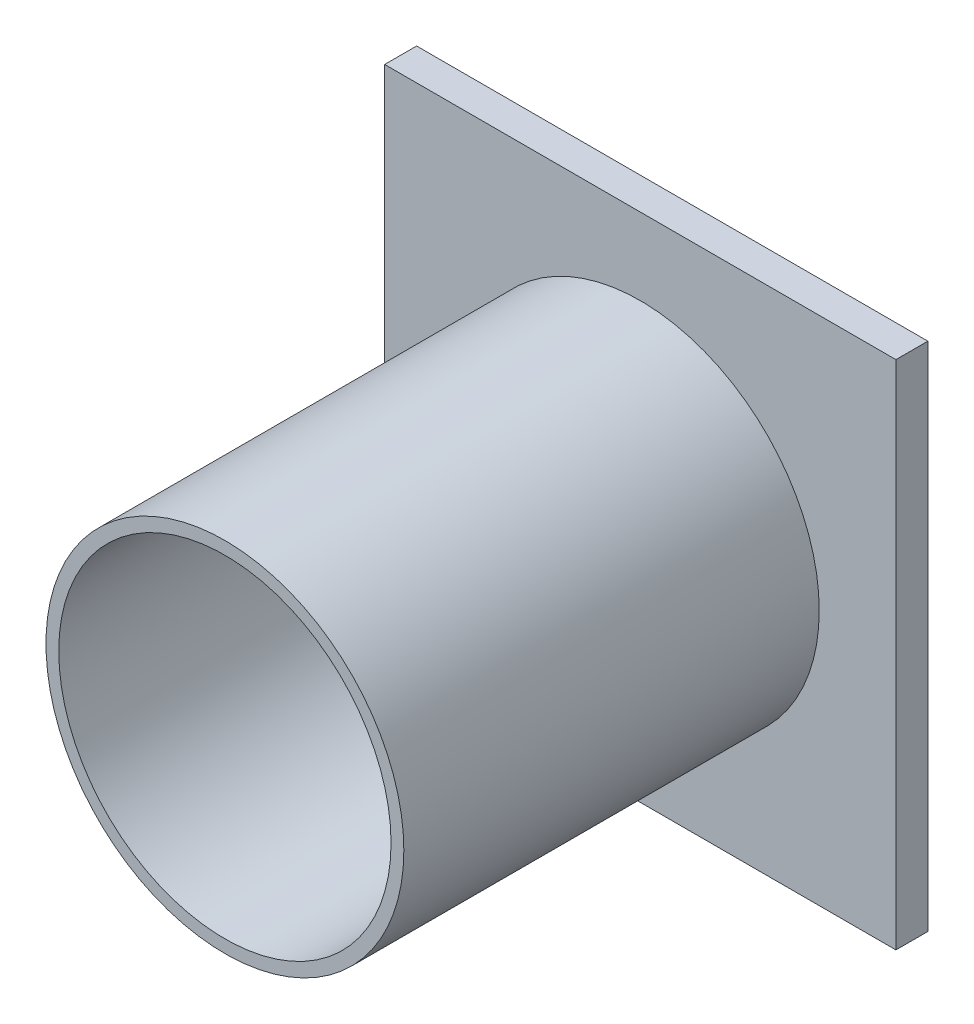
ISO-10303-21;
HEADER;
FILE_DESCRIPTION(('STEP AP214'),'2;1');
FILE_NAME('part.step','',(''),(''),'','','');
FILE_SCHEMA(('AUTOMOTIVE_DESIGN { 1 0 10303 214 1 1 1 1 }'));
ENDSEC;
DATA;
#1=APPLICATION_CONTEXT('core data for automotive mechanical design processes');
#2=APPLICATION_PROTOCOL_DEFINITION('international standard','automotive_design',2000,#1);
#3=PRODUCT_CONTEXT('',#1,'mechanical');
#4=PRODUCT('Part','Part','',(#3));
#5=PRODUCT_RELATED_PRODUCT_CATEGORY('part','',(#4));
#6=PRODUCT_DEFINITION_FORMATION('','',#4);
#7=PRODUCT_DEFINITION_CONTEXT('part definition',#1,'design');
#8=PRODUCT_DEFINITION('design','',#6,#7);
#9=PRODUCT_DEFINITION_SHAPE('','',#8);
#10=(LENGTH_UNIT() NAMED_UNIT(*) SI_UNIT(.MILLI.,.METRE.));
#11=(NAMED_UNIT(*) PLANE_ANGLE_UNIT() SI_UNIT($,.RADIAN.));
#12=(NAMED_UNIT(*) SI_UNIT($,.STERADIAN.) SOLID_ANGLE_UNIT());
#13=UNCERTAINTY_MEASURE_WITH_UNIT(LENGTH_MEASURE(1.E-05),#10,'distance_accuracy_value','');
#14=(GEOMETRIC_REPRESENTATION_CONTEXT(3) GLOBAL_UNCERTAINTY_ASSIGNED_CONTEXT((#13)) GLOBAL_UNIT_ASSIGNED_CONTEXT((#10,
#11,#12)) REPRESENTATION_CONTEXT('',''));
#15=CARTESIAN_POINT('',(0.,0.,0.));
#16=DIRECTION('',(0.,0.,1.));
#17=DIRECTION('',(1.,0.,0.));
#18=AXIS2_PLACEMENT_3D('',#15,#16,#17);
#19=CARTESIAN_POINT('',(-29.9186991869918,28.9430894308943,5.));
#20=DIRECTION('',(1.,0.,0.));
#21=DIRECTION('',(0.,1.,0.));
#22=AXIS2_PLACEMENT_3D('',#19,#20,#21);
#23=PLANE('',#22);
#24=DIRECTION('',(0.,-1.,0.));
#25=VECTOR('',#24,1.);
#26=CARTESIAN_POINT('',(-29.9186991869918,28.9430894308943,0.));
#27=LINE('',#26,#25);
#28=CARTESIAN_POINT('',(-29.9186991869918,28.9430894308943,0.));
#29=VERTEX_POINT('',#28);
#30=CARTESIAN_POINT('',(-29.9186991869918,-51.0569105691057,0.));
#31=VERTEX_POINT('',#30);
#32=EDGE_CURVE('E104',#29,#31,#27,.T.);
#33=ORIENTED_EDGE('',*,*,#32,.T.);
#34=DIRECTION('',(0.,0.,-1.));
#35=VECTOR('',#34,1.);
#36=CARTESIAN_POINT('',(-29.9186991869918,-51.0569105691057,5.));
#37=LINE('',#36,#35);
#38=CARTESIAN_POINT('',(-29.9186991869918,-51.0569105691057,5.));
#39=VERTEX_POINT('',#38);
#40=EDGE_CURVE('E46',#39,#31,#37,.T.);
#41=ORIENTED_EDGE('',*,*,#40,.F.);
#42=DIRECTION('',(0.,-1.,0.));
#43=VECTOR('',#42,1.);
#44=CARTESIAN_POINT('',(-29.9186991869918,28.9430894308943,5.));
#45=LINE('',#44,#43);
#46=CARTESIAN_POINT('',(-29.9186991869918,28.9430894308943,5.));
#47=VERTEX_POINT('',#46);
#48=EDGE_CURVE('E90',#47,#39,#45,.T.);
#49=ORIENTED_EDGE('',*,*,#48,.F.);
#50=DIRECTION('',(0.,0.,-1.));
#51=VECTOR('',#50,1.);
#52=CARTESIAN_POINT('',(-29.9186991869918,28.9430894308943,5.));
#53=LINE('',#52,#51);
#54=EDGE_CURVE('E100',#47,#29,#53,.T.);
#55=ORIENTED_EDGE('',*,*,#54,.T.);
#56=EDGE_LOOP('',(#33,#41,#49,#55));
#57=FACE_BOUND('',#56,.T.);
#58=ADVANCED_FACE('F38',(#57),#23,.F.);
#59=CARTESIAN_POINT('',(-29.9186991869918,-51.0569105691057,5.));
#60=DIRECTION('',(0.,1.,0.));
#61=DIRECTION('',(0.,0.,1.));
#62=AXIS2_PLACEMENT_3D('',#59,#60,#61);
#63=PLANE('',#62);
#64=DIRECTION('',(1.,0.,0.));
#65=VECTOR('',#64,1.);
#66=CARTESIAN_POINT('',(-29.9186991869918,-51.0569105691057,0.));
#67=LINE('',#66,#65);
#68=CARTESIAN_POINT('',(50.0813008130082,-51.0569105691057,0.));
#69=VERTEX_POINT('',#68);
#70=EDGE_CURVE('E95',#31,#69,#67,.T.);
#71=ORIENTED_EDGE('',*,*,#70,.T.);
#72=DIRECTION('',(0.,0.,-1.));
#73=VECTOR('',#72,1.);
#74=CARTESIAN_POINT('',(50.0813008130082,-51.0569105691057,5.));
#75=LINE('',#74,#73);
#76=CARTESIAN_POINT('',(50.0813008130082,-51.0569105691057,5.));
#77=VERTEX_POINT('',#76);
#78=EDGE_CURVE('E93',#77,#69,#75,.T.);
#79=ORIENTED_EDGE('',*,*,#78,.F.);
#80=DIRECTION('',(1.,0.,0.));
#81=VECTOR('',#80,1.);
#82=CARTESIAN_POINT('',(-29.9186991869918,-51.0569105691057,5.));
#83=LINE('',#82,#81);
#84=EDGE_CURVE('E85',#39,#77,#83,.T.);
#85=ORIENTED_EDGE('',*,*,#84,.F.);
#86=ORIENTED_EDGE('',*,*,#40,.T.);
#87=EDGE_LOOP('',(#71,#79,#85,#86));
#88=FACE_BOUND('',#87,.T.);
#89=ADVANCED_FACE('F94',(#88),#63,.F.);
#90=CARTESIAN_POINT('',(50.0813008130082,28.9430894308943,5.));
#91=DIRECTION('',(-1.,0.,0.));
#92=DIRECTION('',(0.,-1.,0.));
#93=AXIS2_PLACEMENT_3D('',#90,#91,#92);
#94=PLANE('',#93);
#95=DIRECTION('',(0.,1.,0.));
#96=VECTOR('',#95,1.);
#97=CARTESIAN_POINT('',(50.0813008130082,28.9430894308943,0.));
#98=LINE('',#97,#96);
#99=CARTESIAN_POINT('',(50.0813008130082,28.9430894308943,0.));
#100=VERTEX_POINT('',#99);
#101=EDGE_CURVE('E71',#69,#100,#98,.T.);
#102=ORIENTED_EDGE('',*,*,#101,.T.);
#103=DIRECTION('',(0.,0.,-1.));
#104=VECTOR('',#103,1.);
#105=CARTESIAN_POINT('',(50.0813008130082,28.9430894308943,5.));
#106=LINE('',#105,#104);
#107=CARTESIAN_POINT('',(50.0813008130082,28.9430894308943,5.));
#108=VERTEX_POINT('',#107);
#109=EDGE_CURVE('E96',#108,#100,#106,.T.);
#110=ORIENTED_EDGE('',*,*,#109,.F.);
#111=DIRECTION('',(0.,1.,0.));
#112=VECTOR('',#111,1.);
#113=CARTESIAN_POINT('',(50.0813008130082,28.9430894308943,5.));
#114=LINE('',#113,#112);
#115=EDGE_CURVE('E88',#77,#108,#114,.T.);
#116=ORIENTED_EDGE('',*,*,#115,.F.);
#117=ORIENTED_EDGE('',*,*,#78,.T.);
#118=EDGE_LOOP('',(#102,#110,#116,#117));
#119=FACE_BOUND('',#118,.T.);
#120=ADVANCED_FACE('F98',(#119),#94,.F.);
#121=CARTESIAN_POINT('',(-29.9186991869918,28.9430894308943,5.));
#122=DIRECTION('',(0.,-1.,0.));
#123=DIRECTION('',(0.,0.,-1.));
#124=AXIS2_PLACEMENT_3D('',#121,#122,#123);
#125=PLANE('',#124);
#126=DIRECTION('',(-1.,0.,0.));
#127=VECTOR('',#126,1.);
#128=CARTESIAN_POINT('',(-29.9186991869918,28.9430894308943,0.));
#129=LINE('',#128,#127);
#130=EDGE_CURVE('E77',#100,#29,#129,.T.);
#131=ORIENTED_EDGE('',*,*,#130,.T.);
#132=ORIENTED_EDGE('',*,*,#54,.F.);
#133=DIRECTION('',(-1.,0.,0.));
#134=VECTOR('',#133,1.);
#135=CARTESIAN_POINT('',(-29.9186991869918,28.9430894308943,5.));
#136=LINE('',#135,#134);
#137=EDGE_CURVE('E54',#108,#47,#136,.T.);
#138=ORIENTED_EDGE('',*,*,#137,.F.);
#139=ORIENTED_EDGE('',*,*,#109,.T.);
#140=EDGE_LOOP('',(#131,#132,#138,#139));
#141=FACE_BOUND('',#140,.T.);
#142=ADVANCED_FACE('F126',(#141),#125,.F.);
#143=CARTESIAN_POINT('',(0.,0.,5.));
#144=DIRECTION('',(0.,0.,1.));
#145=DIRECTION('',(1.,0.,0.));
#146=AXIS2_PLACEMENT_3D('',#143,#144,#145);
#147=PLANE('',#146);
#148=CARTESIAN_POINT('',(10.0813008130082,-11.0569105691057,5.));
#149=DIRECTION('',(0.,0.,1.));
#150=DIRECTION('',(1.,0.,0.));
#151=AXIS2_PLACEMENT_3D('',#148,#149,#150);
#152=CIRCLE('',#151,28.);
#153=CARTESIAN_POINT('',(38.0813008130082,-11.0569105691057,5.));
#154=VERTEX_POINT('',#153);
#155=EDGE_CURVE('E195',#154,#154,#152,.T.);
#156=ORIENTED_EDGE('',*,*,#155,.F.);
#157=EDGE_LOOP('',(#156));
#158=FACE_BOUND('',#157,.T.);
#159=ORIENTED_EDGE('',*,*,#48,.T.);
#160=ORIENTED_EDGE('',*,*,#84,.T.);
#161=ORIENTED_EDGE('',*,*,#115,.T.);
#162=ORIENTED_EDGE('',*,*,#137,.T.);
#163=EDGE_LOOP('',(#159,#160,#161,#162));
#164=FACE_BOUND('',#163,.T.);
#165=ADVANCED_FACE('F86',(#158,#164),#147,.T.);
#166=CARTESIAN_POINT('',(0.,0.,0.));
#167=DIRECTION('',(0.,0.,1.));
#168=DIRECTION('',(1.,0.,0.));
#169=AXIS2_PLACEMENT_3D('',#166,#167,#168);
#170=PLANE('',#169);
#171=ORIENTED_EDGE('',*,*,#32,.F.);
#172=ORIENTED_EDGE('',*,*,#130,.F.);
#173=ORIENTED_EDGE('',*,*,#101,.F.);
#174=ORIENTED_EDGE('',*,*,#70,.F.);
#175=EDGE_LOOP('',(#171,#172,#173,#174));
#176=FACE_BOUND('',#175,.T.);
#177=ADVANCED_FACE('F115',(#176),#170,.F.);
#178=CARTESIAN_POINT('',(10.0813008130082,-11.0569105691057,70.));
#179=DIRECTION('',(0.,0.,1.));
#180=DIRECTION('',(1.,0.,0.));
#181=AXIS2_PLACEMENT_3D('',#178,#179,#180);
#182=PLANE('',#181);
#183=CARTESIAN_POINT('',(10.0813008130082,-11.0569105691057,70.));
#184=DIRECTION('',(0.,0.,1.));
#185=DIRECTION('',(1.,0.,0.));
#186=AXIS2_PLACEMENT_3D('',#183,#184,#185);
#187=CIRCLE('',#186,28.);
#188=CARTESIAN_POINT('',(38.0813008130082,-11.0569105691057,70.));
#189=VERTEX_POINT('',#188);
#190=EDGE_CURVE('E107',#189,#189,#187,.T.);
#191=ORIENTED_EDGE('',*,*,#190,.T.);
#192=EDGE_LOOP('',(#191));
#193=FACE_BOUND('',#192,.T.);
#194=CARTESIAN_POINT('',(10.0813008130082,-11.0569105691057,70.));
#195=DIRECTION('',(0.,0.,1.));
#196=DIRECTION('',(1.,0.,0.));
#197=AXIS2_PLACEMENT_3D('',#194,#195,#196);
#198=CIRCLE('',#197,26.);
#199=CARTESIAN_POINT('',(36.0813008130082,-11.0569105691057,70.));
#200=VERTEX_POINT('',#199);
#201=EDGE_CURVE('E193',#200,#200,#198,.T.);
#202=ORIENTED_EDGE('',*,*,#201,.F.);
#203=EDGE_LOOP('',(#202));
#204=FACE_BOUND('',#203,.T.);
#205=ADVANCED_FACE('F117',(#193,#204),#182,.T.);
#206=CARTESIAN_POINT('',(10.0813008130082,-11.0569105691057,70.));
#207=DIRECTION('',(0.,0.,-1.));
#208=DIRECTION('',(-1.,0.,0.));
#209=AXIS2_PLACEMENT_3D('',#206,#207,#208);
#210=CYLINDRICAL_SURFACE('',#209,28.);
#211=ORIENTED_EDGE('',*,*,#190,.F.);
#212=EDGE_LOOP('',(#211));
#213=FACE_BOUND('',#212,.T.);
#214=ORIENTED_EDGE('',*,*,#155,.T.);
#215=EDGE_LOOP('',(#214));
#216=FACE_BOUND('',#215,.T.);
#217=ADVANCED_FACE('F123',(#213,#216),#210,.T.);
#218=CARTESIAN_POINT('',(10.0813008130082,-11.0569105691057,70.));
#219=DIRECTION('',(0.,0.,-1.));
#220=DIRECTION('',(-1.,0.,0.));
#221=AXIS2_PLACEMENT_3D('',#218,#219,#220);
#222=CYLINDRICAL_SURFACE('',#221,26.);
#223=ORIENTED_EDGE('',*,*,#201,.T.);
#224=EDGE_LOOP('',(#223));
#225=FACE_BOUND('',#224,.T.);
#226=CARTESIAN_POINT('',(10.0813008130082,-11.0569105691057,5.));
#227=DIRECTION('',(0.,0.,1.));
#228=DIRECTION('',(1.,0.,0.));
#229=AXIS2_PLACEMENT_3D('',#226,#227,#228);
#230=CIRCLE('',#229,26.);
#231=CARTESIAN_POINT('',(36.0813008130082,-11.0569105691057,5.));
#232=VERTEX_POINT('',#231);
#233=EDGE_CURVE('E12',#232,#232,#230,.F.);
#234=ORIENTED_EDGE('',*,*,#233,.T.);
#235=EDGE_LOOP('',(#234));
#236=FACE_BOUND('',#235,.T.);
#237=ADVANCED_FACE('F166',(#225,#236),#222,.F.);
#238=ORIENTED_EDGE('',*,*,#233,.F.);
#239=EDGE_LOOP('',(#238));
#240=FACE_BOUND('',#239,.T.);
#241=ADVANCED_FACE('F129',(#240),#147,.T.);
#242=CLOSED_SHELL('',(#58,#89,#120,#142,#165,#177,#205,#217,#237,#241));
#243=MANIFOLD_SOLID_BREP('B2',#242);
#244=ADVANCED_BREP_SHAPE_REPRESENTATION('',(#18,#243),#14);
#245=SHAPE_DEFINITION_REPRESENTATION(#9,#244);
ENDSEC;
END-ISO-10303-21;
